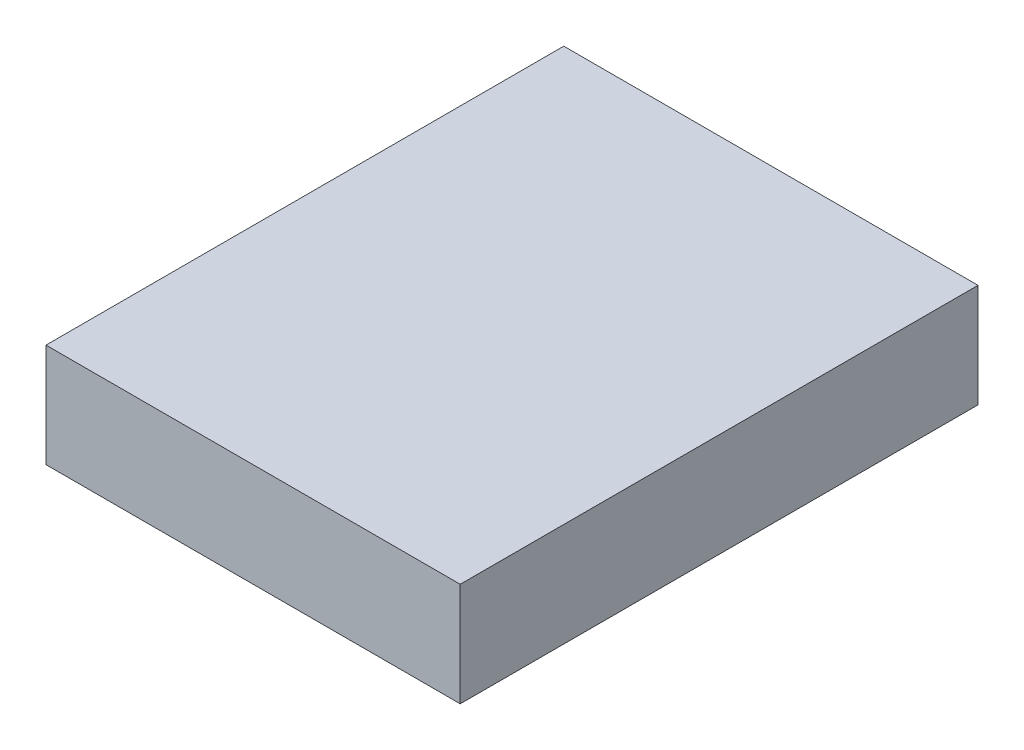
ISO-10303-21;
HEADER;
FILE_DESCRIPTION(('STEP AP214'),'2;1');
FILE_NAME('part.step','',(''),(''),'','','');
FILE_SCHEMA(('AUTOMOTIVE_DESIGN { 1 0 10303 214 1 1 1 1 }'));
ENDSEC;
DATA;
#1=APPLICATION_CONTEXT('core data for automotive mechanical design processes');
#2=APPLICATION_PROTOCOL_DEFINITION('international standard','automotive_design',2000,#1);
#3=PRODUCT_CONTEXT('',#1,'mechanical');
#4=PRODUCT('Part','Part','',(#3));
#5=PRODUCT_RELATED_PRODUCT_CATEGORY('part','',(#4));
#6=PRODUCT_DEFINITION_FORMATION('','',#4);
#7=PRODUCT_DEFINITION_CONTEXT('part definition',#1,'design');
#8=PRODUCT_DEFINITION('design','',#6,#7);
#9=PRODUCT_DEFINITION_SHAPE('','',#8);
#10=(LENGTH_UNIT() NAMED_UNIT(*) SI_UNIT(.MILLI.,.METRE.));
#11=(NAMED_UNIT(*) PLANE_ANGLE_UNIT() SI_UNIT($,.RADIAN.));
#12=(NAMED_UNIT(*) SI_UNIT($,.STERADIAN.) SOLID_ANGLE_UNIT());
#13=UNCERTAINTY_MEASURE_WITH_UNIT(LENGTH_MEASURE(1.E-05),#10,'distance_accuracy_value','');
#14=(GEOMETRIC_REPRESENTATION_CONTEXT(3) GLOBAL_UNCERTAINTY_ASSIGNED_CONTEXT((#13)) GLOBAL_UNIT_ASSIGNED_CONTEXT((#10,
#11,#12)) REPRESENTATION_CONTEXT('',''));
#15=CARTESIAN_POINT('',(0.,0.,0.));
#16=DIRECTION('',(0.,0.,1.));
#17=DIRECTION('',(1.,0.,0.));
#18=AXIS2_PLACEMENT_3D('',#15,#16,#17);
#19=CARTESIAN_POINT('',(0.,2.54,0.));
#20=DIRECTION('',(1.,0.,0.));
#21=DIRECTION('',(0.,0.,-1.));
#22=AXIS2_PLACEMENT_3D('',#19,#20,#21);
#23=PLANE('',#22);
#24=DIRECTION('',(0.,0.,1.));
#25=VECTOR('',#24,1.);
#26=CARTESIAN_POINT('',(0.,0.,0.));
#27=LINE('',#26,#25);
#28=CARTESIAN_POINT('',(0.,0.,-12.7));
#29=VERTEX_POINT('',#28);
#30=CARTESIAN_POINT('',(0.,0.,0.));
#31=VERTEX_POINT('',#30);
#32=EDGE_CURVE('E96',#29,#31,#27,.T.);
#33=ORIENTED_EDGE('',*,*,#32,.T.);
#34=DIRECTION('',(0.,-1.,0.));
#35=VECTOR('',#34,1.);
#36=CARTESIAN_POINT('',(0.,2.54,0.));
#37=LINE('',#36,#35);
#38=CARTESIAN_POINT('',(0.,2.54,0.));
#39=VERTEX_POINT('',#38);
#40=EDGE_CURVE('E11',#39,#31,#37,.T.);
#41=ORIENTED_EDGE('',*,*,#40,.F.);
#42=DIRECTION('',(0.,0.,1.));
#43=VECTOR('',#42,1.);
#44=CARTESIAN_POINT('',(0.,2.54,0.));
#45=LINE('',#44,#43);
#46=CARTESIAN_POINT('',(0.,2.54,-12.7));
#47=VERTEX_POINT('',#46);
#48=EDGE_CURVE('E84',#47,#39,#45,.T.);
#49=ORIENTED_EDGE('',*,*,#48,.F.);
#50=DIRECTION('',(0.,-1.,0.));
#51=VECTOR('',#50,1.);
#52=CARTESIAN_POINT('',(0.,2.54,-12.7));
#53=LINE('',#52,#51);
#54=EDGE_CURVE('E92',#47,#29,#53,.T.);
#55=ORIENTED_EDGE('',*,*,#54,.T.);
#56=EDGE_LOOP('',(#33,#41,#49,#55));
#57=FACE_BOUND('',#56,.T.);
#58=ADVANCED_FACE('F33',(#57),#23,.F.);
#59=CARTESIAN_POINT('',(0.,2.54,0.));
#60=DIRECTION('',(0.,0.,-1.));
#61=DIRECTION('',(-1.,0.,0.));
#62=AXIS2_PLACEMENT_3D('',#59,#60,#61);
#63=PLANE('',#62);
#64=DIRECTION('',(1.,0.,0.));
#65=VECTOR('',#64,1.);
#66=CARTESIAN_POINT('',(0.,0.,0.));
#67=LINE('',#66,#65);
#68=CARTESIAN_POINT('',(10.16,0.,0.));
#69=VERTEX_POINT('',#68);
#70=EDGE_CURVE('E88',#31,#69,#67,.T.);
#71=ORIENTED_EDGE('',*,*,#70,.T.);
#72=DIRECTION('',(0.,-1.,0.));
#73=VECTOR('',#72,1.);
#74=CARTESIAN_POINT('',(10.16,2.54,0.));
#75=LINE('',#74,#73);
#76=CARTESIAN_POINT('',(10.16,2.54,0.));
#77=VERTEX_POINT('',#76);
#78=EDGE_CURVE('E41',#77,#69,#75,.T.);
#79=ORIENTED_EDGE('',*,*,#78,.F.);
#80=DIRECTION('',(1.,0.,0.));
#81=VECTOR('',#80,1.);
#82=CARTESIAN_POINT('',(0.,2.54,0.));
#83=LINE('',#82,#81);
#84=EDGE_CURVE('E79',#39,#77,#83,.T.);
#85=ORIENTED_EDGE('',*,*,#84,.F.);
#86=ORIENTED_EDGE('',*,*,#40,.T.);
#87=EDGE_LOOP('',(#71,#79,#85,#86));
#88=FACE_BOUND('',#87,.T.);
#89=ADVANCED_FACE('F87',(#88),#63,.F.);
#90=CARTESIAN_POINT('',(10.16,2.54,0.));
#91=DIRECTION('',(-1.,0.,0.));
#92=DIRECTION('',(0.,0.,1.));
#93=AXIS2_PLACEMENT_3D('',#90,#91,#92);
#94=PLANE('',#93);
#95=DIRECTION('',(0.,0.,-1.));
#96=VECTOR('',#95,1.);
#97=CARTESIAN_POINT('',(10.16,0.,0.));
#98=LINE('',#97,#96);
#99=CARTESIAN_POINT('',(10.16,0.,-12.7));
#100=VERTEX_POINT('',#99);
#101=EDGE_CURVE('E66',#69,#100,#98,.T.);
#102=ORIENTED_EDGE('',*,*,#101,.T.);
#103=DIRECTION('',(0.,-1.,0.));
#104=VECTOR('',#103,1.);
#105=CARTESIAN_POINT('',(10.16,2.54,-12.7));
#106=LINE('',#105,#104);
#107=CARTESIAN_POINT('',(10.16,2.54,-12.7));
#108=VERTEX_POINT('',#107);
#109=EDGE_CURVE('E89',#108,#100,#106,.T.);
#110=ORIENTED_EDGE('',*,*,#109,.F.);
#111=DIRECTION('',(0.,0.,-1.));
#112=VECTOR('',#111,1.);
#113=CARTESIAN_POINT('',(10.16,2.54,0.));
#114=LINE('',#113,#112);
#115=EDGE_CURVE('E82',#77,#108,#114,.T.);
#116=ORIENTED_EDGE('',*,*,#115,.F.);
#117=ORIENTED_EDGE('',*,*,#78,.T.);
#118=EDGE_LOOP('',(#102,#110,#116,#117));
#119=FACE_BOUND('',#118,.T.);
#120=ADVANCED_FACE('F90',(#119),#94,.F.);
#121=CARTESIAN_POINT('',(0.,2.54,-12.7));
#122=DIRECTION('',(0.,0.,1.));
#123=DIRECTION('',(1.,0.,0.));
#124=AXIS2_PLACEMENT_3D('',#121,#122,#123);
#125=PLANE('',#124);
#126=DIRECTION('',(-1.,0.,0.));
#127=VECTOR('',#126,1.);
#128=CARTESIAN_POINT('',(0.,0.,-12.7));
#129=LINE('',#128,#127);
#130=EDGE_CURVE('E72',#100,#29,#129,.T.);
#131=ORIENTED_EDGE('',*,*,#130,.T.);
#132=ORIENTED_EDGE('',*,*,#54,.F.);
#133=DIRECTION('',(-1.,0.,0.));
#134=VECTOR('',#133,1.);
#135=CARTESIAN_POINT('',(0.,2.54,-12.7));
#136=LINE('',#135,#134);
#137=EDGE_CURVE('E49',#108,#47,#136,.T.);
#138=ORIENTED_EDGE('',*,*,#137,.F.);
#139=ORIENTED_EDGE('',*,*,#109,.T.);
#140=EDGE_LOOP('',(#131,#132,#138,#139));
#141=FACE_BOUND('',#140,.T.);
#142=ADVANCED_FACE('F103',(#141),#125,.F.);
#143=CARTESIAN_POINT('',(0.,2.54,0.));
#144=DIRECTION('',(0.,-1.,0.));
#145=DIRECTION('',(0.,0.,-1.));
#146=AXIS2_PLACEMENT_3D('',#143,#144,#145);
#147=PLANE('',#146);
#148=ORIENTED_EDGE('',*,*,#48,.T.);
#149=ORIENTED_EDGE('',*,*,#84,.T.);
#150=ORIENTED_EDGE('',*,*,#115,.T.);
#151=ORIENTED_EDGE('',*,*,#137,.T.);
#152=EDGE_LOOP('',(#148,#149,#150,#151));
#153=FACE_BOUND('',#152,.T.);
#154=ADVANCED_FACE('F80',(#153),#147,.F.);
#155=CARTESIAN_POINT('',(0.,0.,0.));
#156=DIRECTION('',(0.,-1.,0.));
#157=DIRECTION('',(0.,0.,-1.));
#158=AXIS2_PLACEMENT_3D('',#155,#156,#157);
#159=PLANE('',#158);
#160=ORIENTED_EDGE('',*,*,#32,.F.);
#161=ORIENTED_EDGE('',*,*,#130,.F.);
#162=ORIENTED_EDGE('',*,*,#101,.F.);
#163=ORIENTED_EDGE('',*,*,#70,.F.);
#164=EDGE_LOOP('',(#160,#161,#162,#163));
#165=FACE_BOUND('',#164,.T.);
#166=ADVANCED_FACE('F106',(#165),#159,.T.);
#167=CLOSED_SHELL('',(#58,#89,#120,#142,#154,#166));
#168=MANIFOLD_SOLID_BREP('B2',#167);
#169=ADVANCED_BREP_SHAPE_REPRESENTATION('',(#18,#168),#14);
#170=SHAPE_DEFINITION_REPRESENTATION(#9,#169);
ENDSEC;
END-ISO-10303-21;
